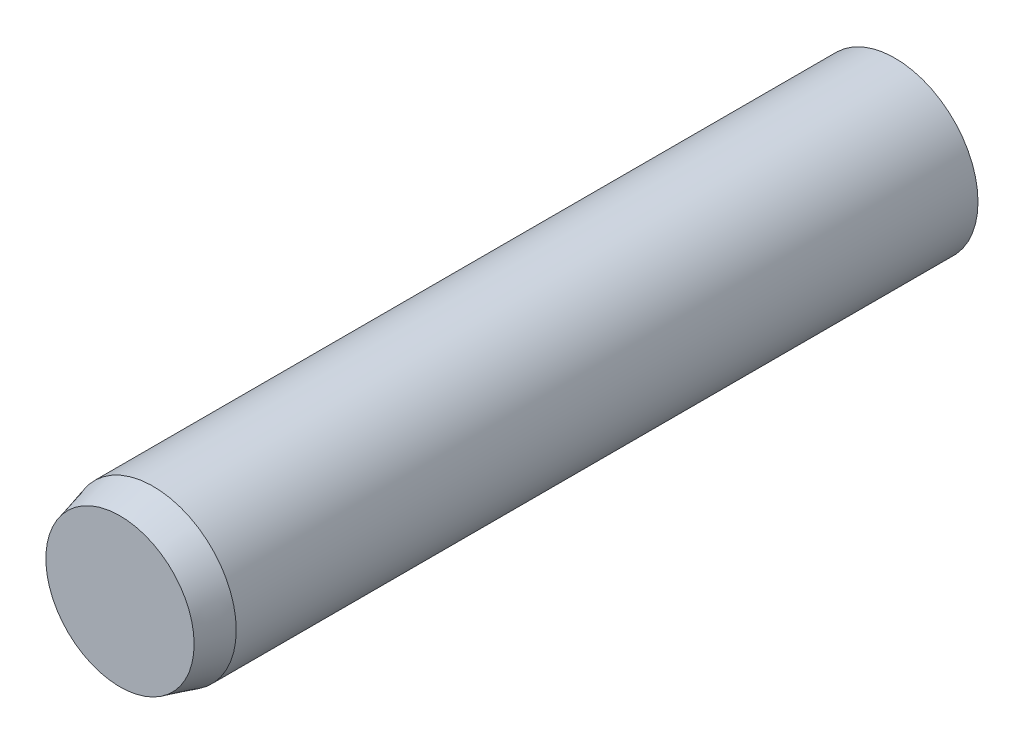
ISO-10303-21;
HEADER;
FILE_DESCRIPTION(('STEP AP214'),'2;1');
FILE_NAME('part.step','',(''),(''),'','','');
FILE_SCHEMA(('AUTOMOTIVE_DESIGN { 1 0 10303 214 1 1 1 1 }'));
ENDSEC;
DATA;
#1=APPLICATION_CONTEXT('core data for automotive mechanical design processes');
#2=APPLICATION_PROTOCOL_DEFINITION('international standard','automotive_design',2000,#1);
#3=PRODUCT_CONTEXT('',#1,'mechanical');
#4=PRODUCT('Part','Part','',(#3));
#5=PRODUCT_RELATED_PRODUCT_CATEGORY('part','',(#4));
#6=PRODUCT_DEFINITION_FORMATION('','',#4);
#7=PRODUCT_DEFINITION_CONTEXT('part definition',#1,'design');
#8=PRODUCT_DEFINITION('design','',#6,#7);
#9=PRODUCT_DEFINITION_SHAPE('','',#8);
#10=(LENGTH_UNIT() NAMED_UNIT(*) SI_UNIT(.MILLI.,.METRE.));
#11=(NAMED_UNIT(*) PLANE_ANGLE_UNIT() SI_UNIT($,.RADIAN.));
#12=(NAMED_UNIT(*) SI_UNIT($,.STERADIAN.) SOLID_ANGLE_UNIT());
#13=UNCERTAINTY_MEASURE_WITH_UNIT(LENGTH_MEASURE(1.E-05),#10,'distance_accuracy_value','');
#14=(GEOMETRIC_REPRESENTATION_CONTEXT(3) GLOBAL_UNCERTAINTY_ASSIGNED_CONTEXT((#13)) GLOBAL_UNIT_ASSIGNED_CONTEXT((#10,
#11,#12)) REPRESENTATION_CONTEXT('',''));
#15=CARTESIAN_POINT('',(0.,0.,0.));
#16=DIRECTION('',(0.,0.,1.));
#17=DIRECTION('',(1.,0.,0.));
#18=AXIS2_PLACEMENT_3D('',#15,#16,#17);
#19=CARTESIAN_POINT('',(0.,0.,14.));
#20=DIRECTION('',(0.,0.,-1.));
#21=DIRECTION('',(-1.,0.,0.));
#22=AXIS2_PLACEMENT_3D('',#19,#20,#21);
#23=CYLINDRICAL_SURFACE('',#22,1.5);
#24=CARTESIAN_POINT('',(0.,0.,13.4));
#25=DIRECTION('',(0.,0.,1.));
#26=DIRECTION('',(1.,0.,0.));
#27=AXIS2_PLACEMENT_3D('',#24,#25,#26);
#28=CIRCLE('',#27,1.5);
#29=CARTESIAN_POINT('',(1.5,0.,13.4));
#30=VERTEX_POINT('',#29);
#31=EDGE_CURVE('E10',#30,#30,#28,.F.);
#32=ORIENTED_EDGE('',*,*,#31,.T.);
#33=EDGE_LOOP('',(#32));
#34=FACE_BOUND('',#33,.T.);
#35=CARTESIAN_POINT('',(0.,0.,0.));
#36=DIRECTION('',(0.,0.,1.));
#37=DIRECTION('',(1.,0.,0.));
#38=AXIS2_PLACEMENT_3D('',#35,#36,#37);
#39=CIRCLE('',#38,1.5);
#40=CARTESIAN_POINT('',(1.5,0.,0.));
#41=VERTEX_POINT('',#40);
#42=EDGE_CURVE('E52',#41,#41,#39,.T.);
#43=ORIENTED_EDGE('',*,*,#42,.T.);
#44=EDGE_LOOP('',(#43));
#45=FACE_BOUND('',#44,.T.);
#46=ADVANCED_FACE('F38',(#34,#45),#23,.T.);
#47=CARTESIAN_POINT('',(0.,0.,14.));
#48=DIRECTION('',(0.,0.,1.));
#49=DIRECTION('',(1.,0.,0.));
#50=AXIS2_PLACEMENT_3D('',#47,#48,#49);
#51=PLANE('',#50);
#52=CARTESIAN_POINT('',(0.,0.,14.));
#53=DIRECTION('',(0.,0.,1.));
#54=DIRECTION('',(1.,0.,0.));
#55=AXIS2_PLACEMENT_3D('',#52,#53,#54);
#56=CIRCLE('',#55,1.33923048454132);
#57=CARTESIAN_POINT('',(1.33923048454132,0.,14.));
#58=VERTEX_POINT('',#57);
#59=EDGE_CURVE('E47',#58,#58,#56,.T.);
#60=ORIENTED_EDGE('',*,*,#59,.T.);
#61=EDGE_LOOP('',(#60));
#62=FACE_BOUND('',#61,.T.);
#63=ADVANCED_FACE('F63',(#62),#51,.T.);
#64=CARTESIAN_POINT('',(0.,0.,0.));
#65=DIRECTION('',(0.,0.,1.));
#66=DIRECTION('',(1.,0.,0.));
#67=AXIS2_PLACEMENT_3D('',#64,#65,#66);
#68=PLANE('',#67);
#69=ORIENTED_EDGE('',*,*,#42,.F.);
#70=EDGE_LOOP('',(#69));
#71=FACE_BOUND('',#70,.T.);
#72=ADVANCED_FACE('F61',(#71),#68,.F.);
#73=CARTESIAN_POINT('',(0.,0.,14.));
#74=DIRECTION('',(0.,0.,-1.));
#75=DIRECTION('',(-1.,0.,0.));
#76=AXIS2_PLACEMENT_3D('',#73,#74,#75);
#77=CONICAL_SURFACE('',#76,1.33923048454132,0.261799387799145);
#78=ORIENTED_EDGE('',*,*,#31,.F.);
#79=EDGE_LOOP('',(#78));
#80=FACE_BOUND('',#79,.T.);
#81=ORIENTED_EDGE('',*,*,#59,.F.);
#82=EDGE_LOOP('',(#81));
#83=FACE_BOUND('',#82,.T.);
#84=ADVANCED_FACE('F41',(#80,#83),#77,.T.);
#85=CLOSED_SHELL('',(#46,#63,#72,#84));
#86=MANIFOLD_SOLID_BREP('B2',#85);
#87=ADVANCED_BREP_SHAPE_REPRESENTATION('',(#18,#86),#14);
#88=SHAPE_DEFINITION_REPRESENTATION(#9,#87);
ENDSEC;
END-ISO-10303-21;
